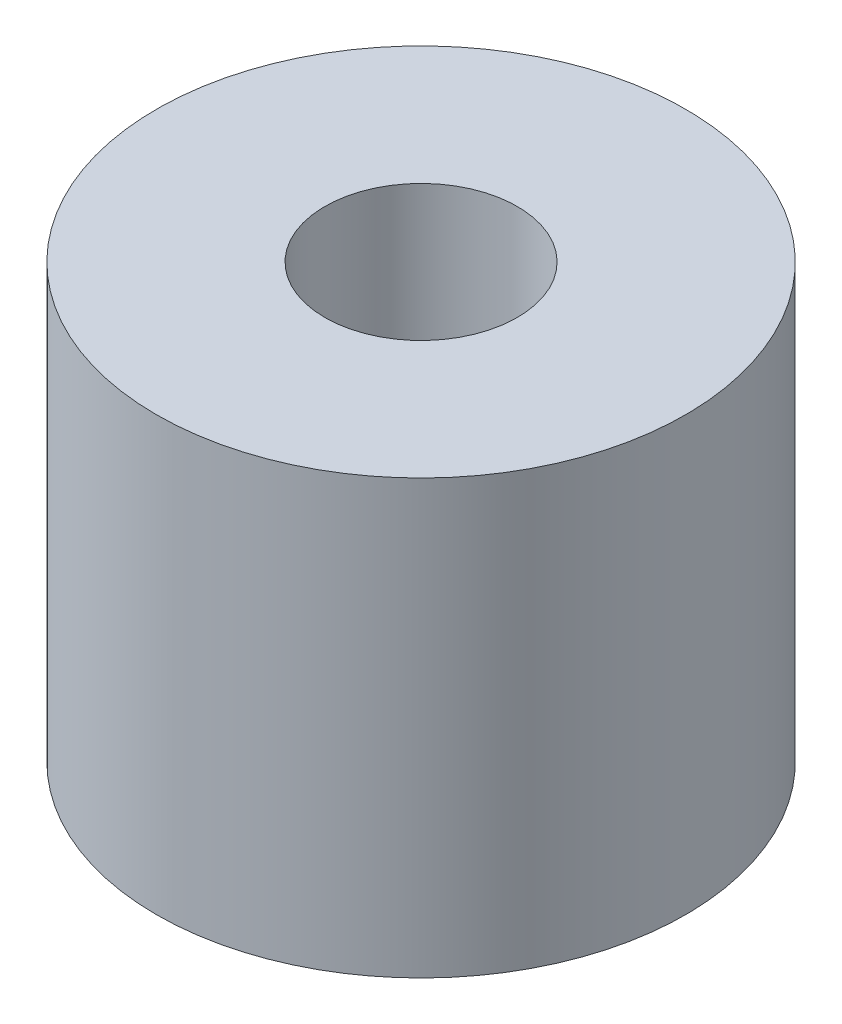
ISO-10303-21;
HEADER;
FILE_DESCRIPTION(('STEP AP214'),'2;1');
FILE_NAME('part.step','',(''),(''),'','','');
FILE_SCHEMA(('AUTOMOTIVE_DESIGN { 1 0 10303 214 1 1 1 1 }'));
ENDSEC;
DATA;
#1=APPLICATION_CONTEXT('core data for automotive mechanical design processes');
#2=APPLICATION_PROTOCOL_DEFINITION('international standard','automotive_design',2000,#1);
#3=PRODUCT_CONTEXT('',#1,'mechanical');
#4=PRODUCT('Part','Part','',(#3));
#5=PRODUCT_RELATED_PRODUCT_CATEGORY('part','',(#4));
#6=PRODUCT_DEFINITION_FORMATION('','',#4);
#7=PRODUCT_DEFINITION_CONTEXT('part definition',#1,'design');
#8=PRODUCT_DEFINITION('design','',#6,#7);
#9=PRODUCT_DEFINITION_SHAPE('','',#8);
#10=(LENGTH_UNIT() NAMED_UNIT(*) SI_UNIT(.MILLI.,.METRE.));
#11=(NAMED_UNIT(*) PLANE_ANGLE_UNIT() SI_UNIT($,.RADIAN.));
#12=(NAMED_UNIT(*) SI_UNIT($,.STERADIAN.) SOLID_ANGLE_UNIT());
#13=UNCERTAINTY_MEASURE_WITH_UNIT(LENGTH_MEASURE(1.E-05),#10,'distance_accuracy_value','');
#14=(GEOMETRIC_REPRESENTATION_CONTEXT(3) GLOBAL_UNCERTAINTY_ASSIGNED_CONTEXT((#13)) GLOBAL_UNIT_ASSIGNED_CONTEXT((#10,
#11,#12)) REPRESENTATION_CONTEXT('',''));
#15=CARTESIAN_POINT('',(0.,0.,0.));
#16=DIRECTION('',(0.,0.,1.));
#17=DIRECTION('',(1.,0.,0.));
#18=AXIS2_PLACEMENT_3D('',#15,#16,#17);
#19=CARTESIAN_POINT('',(-3.01628718415389,18.,-4.6284406791327));
#20=DIRECTION('',(0.,-1.,0.));
#21=DIRECTION('',(0.,0.,-1.));
#22=AXIS2_PLACEMENT_3D('',#19,#20,#21);
#23=CYLINDRICAL_SURFACE('',#22,11.);
#24=CARTESIAN_POINT('',(-3.01628718415389,18.,-4.6284406791327));
#25=DIRECTION('',(0.,1.,0.));
#26=DIRECTION('',(0.,0.,1.));
#27=AXIS2_PLACEMENT_3D('',#24,#25,#26);
#28=CIRCLE('',#27,11.);
#29=CARTESIAN_POINT('',(-3.01628718415389,18.,6.3715593208673));
#30=VERTEX_POINT('',#29);
#31=EDGE_CURVE('E10',#30,#30,#28,.T.);
#32=ORIENTED_EDGE('',*,*,#31,.F.);
#33=EDGE_LOOP('',(#32));
#34=FACE_BOUND('',#33,.T.);
#35=CARTESIAN_POINT('',(-3.01628718415389,0.,-4.6284406791327));
#36=DIRECTION('',(0.,1.,0.));
#37=DIRECTION('',(0.,0.,1.));
#38=AXIS2_PLACEMENT_3D('',#35,#36,#37);
#39=CIRCLE('',#38,11.);
#40=CARTESIAN_POINT('',(-3.01628718415389,0.,6.3715593208673));
#41=VERTEX_POINT('',#40);
#42=EDGE_CURVE('E34',#41,#41,#39,.T.);
#43=ORIENTED_EDGE('',*,*,#42,.T.);
#44=EDGE_LOOP('',(#43));
#45=FACE_BOUND('',#44,.T.);
#46=ADVANCED_FACE('F31',(#34,#45),#23,.T.);
#47=CARTESIAN_POINT('',(-3.01628718415389,18.,-4.6284406791327));
#48=DIRECTION('',(0.,1.,0.));
#49=DIRECTION('',(0.,0.,1.));
#50=AXIS2_PLACEMENT_3D('',#47,#48,#49);
#51=PLANE('',#50);
#52=CARTESIAN_POINT('',(-3.01628718415389,18.,-4.6284406791327));
#53=DIRECTION('',(0.,1.,0.));
#54=DIRECTION('',(0.,0.,1.));
#55=AXIS2_PLACEMENT_3D('',#52,#53,#54);
#56=CIRCLE('',#55,4.);
#57=CARTESIAN_POINT('',(-3.01628718415389,18.,-0.628440679132697));
#58=VERTEX_POINT('',#57);
#59=EDGE_CURVE('E41',#58,#58,#56,.T.);
#60=ORIENTED_EDGE('',*,*,#59,.F.);
#61=EDGE_LOOP('',(#60));
#62=FACE_BOUND('',#61,.T.);
#63=ORIENTED_EDGE('',*,*,#31,.T.);
#64=EDGE_LOOP('',(#63));
#65=FACE_BOUND('',#64,.T.);
#66=ADVANCED_FACE('F58',(#62,#65),#51,.T.);
#67=CARTESIAN_POINT('',(-3.01628718415389,0.,-4.6284406791327));
#68=DIRECTION('',(0.,1.,0.));
#69=DIRECTION('',(0.,0.,1.));
#70=AXIS2_PLACEMENT_3D('',#67,#68,#69);
#71=PLANE('',#70);
#72=CARTESIAN_POINT('',(-3.01628718415389,0.,-4.6284406791327));
#73=DIRECTION('',(0.,1.,0.));
#74=DIRECTION('',(0.,0.,1.));
#75=AXIS2_PLACEMENT_3D('',#72,#73,#74);
#76=CIRCLE('',#75,4.);
#77=CARTESIAN_POINT('',(-3.01628718415389,0.,-0.628440679132697));
#78=VERTEX_POINT('',#77);
#79=EDGE_CURVE('E45',#78,#78,#76,.T.);
#80=ORIENTED_EDGE('',*,*,#79,.T.);
#81=EDGE_LOOP('',(#80));
#82=FACE_BOUND('',#81,.T.);
#83=ORIENTED_EDGE('',*,*,#42,.F.);
#84=EDGE_LOOP('',(#83));
#85=FACE_BOUND('',#84,.T.);
#86=ADVANCED_FACE('F49',(#82,#85),#71,.F.);
#87=CARTESIAN_POINT('',(-3.01628718415389,18.,-4.6284406791327));
#88=DIRECTION('',(0.,1.,0.));
#89=DIRECTION('',(0.,0.,1.));
#90=AXIS2_PLACEMENT_3D('',#87,#88,#89);
#91=CYLINDRICAL_SURFACE('',#90,4.);
#92=ORIENTED_EDGE('',*,*,#79,.F.);
#93=EDGE_LOOP('',(#92));
#94=FACE_BOUND('',#93,.T.);
#95=ORIENTED_EDGE('',*,*,#59,.T.);
#96=EDGE_LOOP('',(#95));
#97=FACE_BOUND('',#96,.T.);
#98=ADVANCED_FACE('F52',(#94,#97),#91,.F.);
#99=CLOSED_SHELL('',(#46,#66,#86,#98));
#100=MANIFOLD_SOLID_BREP('B2',#99);
#101=ADVANCED_BREP_SHAPE_REPRESENTATION('',(#18,#100),#14);
#102=SHAPE_DEFINITION_REPRESENTATION(#9,#101);
ENDSEC;
END-ISO-10303-21;
